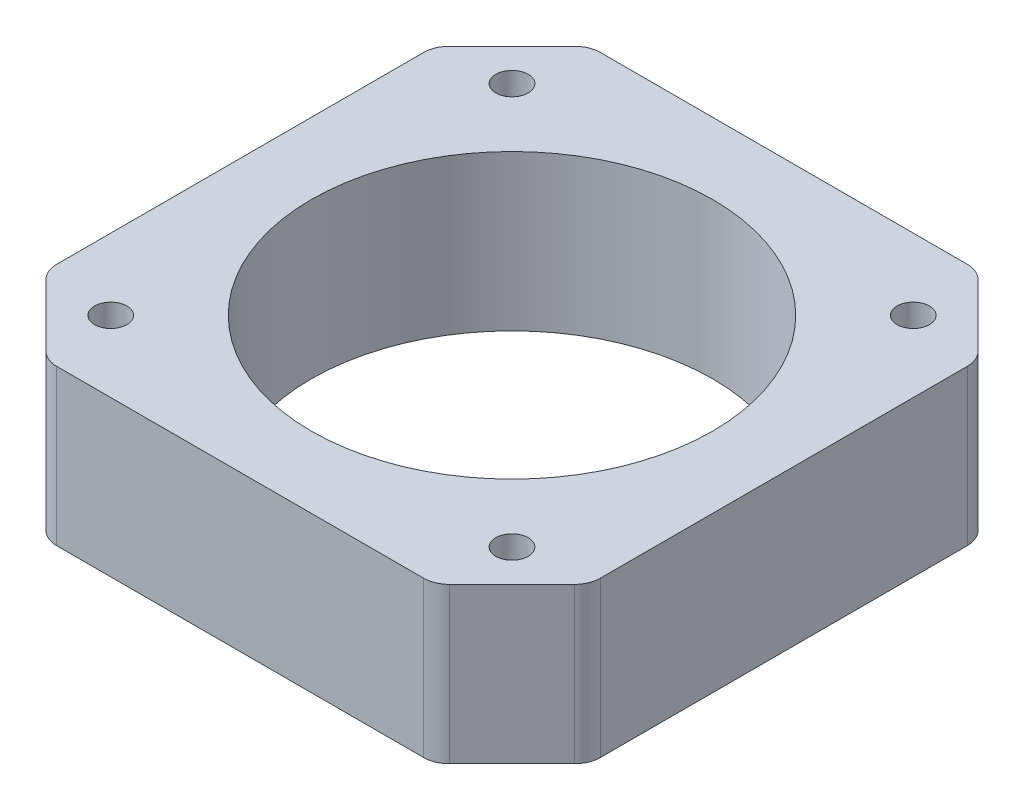
ISO-10303-21;
HEADER;
FILE_DESCRIPTION(('STEP AP214'),'2;1');
FILE_NAME('part.step','',(''),(''),'','','');
FILE_SCHEMA(('AUTOMOTIVE_DESIGN { 1 0 10303 214 1 1 1 1 }'));
ENDSEC;
DATA;
#1=APPLICATION_CONTEXT('core data for automotive mechanical design processes');
#2=APPLICATION_PROTOCOL_DEFINITION('international standard','automotive_design',2000,#1);
#3=PRODUCT_CONTEXT('',#1,'mechanical');
#4=PRODUCT('Part','Part','',(#3));
#5=PRODUCT_RELATED_PRODUCT_CATEGORY('part','',(#4));
#6=PRODUCT_DEFINITION_FORMATION('','',#4);
#7=PRODUCT_DEFINITION_CONTEXT('part definition',#1,'design');
#8=PRODUCT_DEFINITION('design','',#6,#7);
#9=PRODUCT_DEFINITION_SHAPE('','',#8);
#10=(LENGTH_UNIT() NAMED_UNIT(*) SI_UNIT(.MILLI.,.METRE.));
#11=(NAMED_UNIT(*) PLANE_ANGLE_UNIT() SI_UNIT($,.RADIAN.));
#12=(NAMED_UNIT(*) SI_UNIT($,.STERADIAN.) SOLID_ANGLE_UNIT());
#13=UNCERTAINTY_MEASURE_WITH_UNIT(LENGTH_MEASURE(1.E-05),#10,'distance_accuracy_value','');
#14=(GEOMETRIC_REPRESENTATION_CONTEXT(3) GLOBAL_UNCERTAINTY_ASSIGNED_CONTEXT((#13)) GLOBAL_UNIT_ASSIGNED_CONTEXT((#10,
#11,#12)) REPRESENTATION_CONTEXT('',''));
#15=CARTESIAN_POINT('',(0.,0.,0.));
#16=DIRECTION('',(0.,0.,1.));
#17=DIRECTION('',(1.,0.,0.));
#18=AXIS2_PLACEMENT_3D('',#15,#16,#17);
#19=CARTESIAN_POINT('',(0.,12.,0.));
#20=DIRECTION('',(0.,-1.,0.));
#21=DIRECTION('',(0.,0.,-1.));
#22=AXIS2_PLACEMENT_3D('',#19,#20,#21);
#23=PLANE('',#22);
#24=DIRECTION('',(-0.707106781186548,0.,-0.707106781186548));
#25=VECTOR('',#24,1.);
#26=CARTESIAN_POINT('',(21.,12.,-15.0009897922684));
#27=LINE('',#26,#25);
#28=CARTESIAN_POINT('',(20.4142135623731,12.,-15.5867762298953));
#29=VERTEX_POINT('',#28);
#30=CARTESIAN_POINT('',(15.5857864376269,12.,-20.4152033546415));
#31=VERTEX_POINT('',#30);
#32=EDGE_CURVE('E187',#29,#31,#27,.T.);
#33=ORIENTED_EDGE('',*,*,#32,.T.);
#34=CARTESIAN_POINT('',(14.1715728752538,12.,-19.0009897922684));
#35=DIRECTION('',(0.,-1.,0.));
#36=DIRECTION('',(0.,0.,-1.));
#37=AXIS2_PLACEMENT_3D('',#34,#35,#36);
#38=CIRCLE('',#37,2.);
#39=CARTESIAN_POINT('',(14.1715728752538,12.,-21.0009897922684));
#40=VERTEX_POINT('',#39);
#41=EDGE_CURVE('E233',#31,#40,#38,.F.);
#42=ORIENTED_EDGE('',*,*,#41,.T.);
#43=DIRECTION('',(-1.,0.,0.));
#44=VECTOR('',#43,1.);
#45=CARTESIAN_POINT('',(15.,12.,-21.0009897922684));
#46=LINE('',#45,#44);
#47=CARTESIAN_POINT('',(-14.1715728752538,12.,-21.0009897922684));
#48=VERTEX_POINT('',#47);
#49=EDGE_CURVE('E169',#40,#48,#46,.T.);
#50=ORIENTED_EDGE('',*,*,#49,.T.);
#51=CARTESIAN_POINT('',(-14.1715728752538,12.,-19.0009897922684));
#52=DIRECTION('',(0.,-1.,0.));
#53=DIRECTION('',(0.,0.,-1.));
#54=AXIS2_PLACEMENT_3D('',#51,#52,#53);
#55=CIRCLE('',#54,2.);
#56=CARTESIAN_POINT('',(-15.5857864376269,12.,-20.4152033546415));
#57=VERTEX_POINT('',#56);
#58=EDGE_CURVE('E222',#48,#57,#55,.F.);
#59=ORIENTED_EDGE('',*,*,#58,.T.);
#60=DIRECTION('',(-0.707106781186547,0.,0.707106781186548));
#61=VECTOR('',#60,1.);
#62=CARTESIAN_POINT('',(-15.,12.,-21.0009897922684));
#63=LINE('',#62,#61);
#64=CARTESIAN_POINT('',(-20.4142135623731,12.,-15.5867762298953));
#65=VERTEX_POINT('',#64);
#66=EDGE_CURVE('E263',#57,#65,#63,.T.);
#67=ORIENTED_EDGE('',*,*,#66,.T.);
#68=CARTESIAN_POINT('',(-19.,12.,-14.1725626675222));
#69=DIRECTION('',(0.,-1.,0.));
#70=DIRECTION('',(0.,0.,-1.));
#71=AXIS2_PLACEMENT_3D('',#68,#69,#70);
#72=CIRCLE('',#71,2.);
#73=CARTESIAN_POINT('',(-21.,12.,-14.1725626675222));
#74=VERTEX_POINT('',#73);
#75=EDGE_CURVE('E220',#65,#74,#72,.F.);
#76=ORIENTED_EDGE('',*,*,#75,.T.);
#77=DIRECTION('',(0.,0.,1.));
#78=VECTOR('',#77,1.);
#79=CARTESIAN_POINT('',(-21.,12.,15.0009897922684));
#80=LINE('',#79,#78);
#81=CARTESIAN_POINT('',(-21.,12.,14.1725626675222));
#82=VERTEX_POINT('',#81);
#83=EDGE_CURVE('E272',#74,#82,#80,.T.);
#84=ORIENTED_EDGE('',*,*,#83,.T.);
#85=CARTESIAN_POINT('',(-19.,12.,14.1725626675222));
#86=DIRECTION('',(0.,-1.,0.));
#87=DIRECTION('',(0.,0.,-1.));
#88=AXIS2_PLACEMENT_3D('',#85,#86,#87);
#89=CIRCLE('',#88,2.);
#90=CARTESIAN_POINT('',(-20.4142135623731,12.,15.5867762298953));
#91=VERTEX_POINT('',#90);
#92=EDGE_CURVE('E224',#82,#91,#89,.F.);
#93=ORIENTED_EDGE('',*,*,#92,.T.);
#94=DIRECTION('',(0.707106781186548,0.,0.707106781186548));
#95=VECTOR('',#94,1.);
#96=CARTESIAN_POINT('',(-15.,12.,21.0009897922684));
#97=LINE('',#96,#95);
#98=CARTESIAN_POINT('',(-15.5857864376269,12.,20.4152033546415));
#99=VERTEX_POINT('',#98);
#100=EDGE_CURVE('E289',#91,#99,#97,.T.);
#101=ORIENTED_EDGE('',*,*,#100,.T.);
#102=CARTESIAN_POINT('',(-14.1715728752538,12.,19.0009897922684));
#103=DIRECTION('',(0.,-1.,0.));
#104=DIRECTION('',(0.,0.,-1.));
#105=AXIS2_PLACEMENT_3D('',#102,#103,#104);
#106=CIRCLE('',#105,2.);
#107=CARTESIAN_POINT('',(-14.1715728752538,12.,21.0009897922684));
#108=VERTEX_POINT('',#107);
#109=EDGE_CURVE('E226',#99,#108,#106,.F.);
#110=ORIENTED_EDGE('',*,*,#109,.T.);
#111=DIRECTION('',(1.,0.,0.));
#112=VECTOR('',#111,1.);
#113=CARTESIAN_POINT('',(15.,12.,21.0009897922684));
#114=LINE('',#113,#112);
#115=CARTESIAN_POINT('',(14.1715728752538,12.,21.0009897922684));
#116=VERTEX_POINT('',#115);
#117=EDGE_CURVE('E291',#108,#116,#114,.T.);
#118=ORIENTED_EDGE('',*,*,#117,.T.);
#119=CARTESIAN_POINT('',(14.1715728752538,12.,19.0009897922684));
#120=DIRECTION('',(0.,-1.,0.));
#121=DIRECTION('',(0.,0.,-1.));
#122=AXIS2_PLACEMENT_3D('',#119,#120,#121);
#123=CIRCLE('',#122,2.);
#124=CARTESIAN_POINT('',(15.5857864376269,12.,20.4152033546415));
#125=VERTEX_POINT('',#124);
#126=EDGE_CURVE('E228',#116,#125,#123,.F.);
#127=ORIENTED_EDGE('',*,*,#126,.T.);
#128=DIRECTION('',(0.707106781186547,0.,-0.707106781186548));
#129=VECTOR('',#128,1.);
#130=CARTESIAN_POINT('',(21.,12.,15.0009897922684));
#131=LINE('',#130,#129);
#132=CARTESIAN_POINT('',(20.4142135623731,12.,15.5867762298953));
#133=VERTEX_POINT('',#132);
#134=EDGE_CURVE('E294',#125,#133,#131,.T.);
#135=ORIENTED_EDGE('',*,*,#134,.T.);
#136=CARTESIAN_POINT('',(19.,12.,14.1725626675222));
#137=DIRECTION('',(0.,-1.,0.));
#138=DIRECTION('',(0.,0.,-1.));
#139=AXIS2_PLACEMENT_3D('',#136,#137,#138);
#140=CIRCLE('',#139,2.);
#141=CARTESIAN_POINT('',(21.,12.,14.1725626675222));
#142=VERTEX_POINT('',#141);
#143=EDGE_CURVE('E56',#133,#142,#140,.F.);
#144=ORIENTED_EDGE('',*,*,#143,.T.);
#145=DIRECTION('',(0.,0.,-1.));
#146=VECTOR('',#145,1.);
#147=CARTESIAN_POINT('',(21.,12.,15.0009897922684));
#148=LINE('',#147,#146);
#149=CARTESIAN_POINT('',(21.,12.,-14.1725626675222));
#150=VERTEX_POINT('',#149);
#151=EDGE_CURVE('E298',#142,#150,#148,.T.);
#152=ORIENTED_EDGE('',*,*,#151,.T.);
#153=CARTESIAN_POINT('',(19.,12.,-14.1725626675222));
#154=DIRECTION('',(0.,-1.,0.));
#155=DIRECTION('',(0.,0.,-1.));
#156=AXIS2_PLACEMENT_3D('',#153,#154,#155);
#157=CIRCLE('',#156,2.);
#158=EDGE_CURVE('E231',#150,#29,#157,.F.);
#159=ORIENTED_EDGE('',*,*,#158,.T.);
#160=EDGE_LOOP('',(#33,#42,#50,#59,#67,#76,#84,#93,#101,#110,#118,#127,#135,#144,#152,#159));
#161=FACE_BOUND('',#160,.T.);
#162=CARTESIAN_POINT('',(0.,12.,0.));
#163=DIRECTION('',(0.,1.,0.));
#164=DIRECTION('',(0.,0.,1.));
#165=AXIS2_PLACEMENT_3D('',#162,#163,#164);
#166=CIRCLE('',#165,15.5);
#167=CARTESIAN_POINT('',(0.,12.,15.5));
#168=VERTEX_POINT('',#167);
#169=EDGE_CURVE('E178',#168,#168,#166,.T.);
#170=ORIENTED_EDGE('',*,*,#169,.F.);
#171=EDGE_LOOP('',(#170));
#172=FACE_BOUND('',#171,.T.);
#173=CARTESIAN_POINT('',(-15.5,12.,-15.5));
#174=DIRECTION('',(0.,1.,0.));
#175=DIRECTION('',(0.,0.,1.));
#176=AXIS2_PLACEMENT_3D('',#173,#174,#175);
#177=CIRCLE('',#176,1.25000000000001);
#178=CARTESIAN_POINT('',(-15.5,12.,-14.25));
#179=VERTEX_POINT('',#178);
#180=EDGE_CURVE('E410',#179,#179,#177,.T.);
#181=ORIENTED_EDGE('',*,*,#180,.F.);
#182=EDGE_LOOP('',(#181));
#183=FACE_BOUND('',#182,.T.);
#184=CARTESIAN_POINT('',(15.5,12.,-15.5));
#185=DIRECTION('',(0.,1.,0.));
#186=DIRECTION('',(0.,0.,1.));
#187=AXIS2_PLACEMENT_3D('',#184,#185,#186);
#188=CIRCLE('',#187,1.25000000000001);
#189=CARTESIAN_POINT('',(15.5,12.,-14.25));
#190=VERTEX_POINT('',#189);
#191=EDGE_CURVE('E415',#190,#190,#188,.T.);
#192=ORIENTED_EDGE('',*,*,#191,.F.);
#193=EDGE_LOOP('',(#192));
#194=FACE_BOUND('',#193,.T.);
#195=CARTESIAN_POINT('',(-15.5,12.,15.5));
#196=DIRECTION('',(0.,1.,0.));
#197=DIRECTION('',(0.,0.,1.));
#198=AXIS2_PLACEMENT_3D('',#195,#196,#197);
#199=CIRCLE('',#198,1.25000000000001);
#200=CARTESIAN_POINT('',(-15.5,12.,16.75));
#201=VERTEX_POINT('',#200);
#202=EDGE_CURVE('E421',#201,#201,#199,.T.);
#203=ORIENTED_EDGE('',*,*,#202,.F.);
#204=EDGE_LOOP('',(#203));
#205=FACE_BOUND('',#204,.T.);
#206=CARTESIAN_POINT('',(15.5,12.,15.5));
#207=DIRECTION('',(0.,1.,0.));
#208=DIRECTION('',(0.,0.,1.));
#209=AXIS2_PLACEMENT_3D('',#206,#207,#208);
#210=CIRCLE('',#209,1.25000000000001);
#211=CARTESIAN_POINT('',(15.5,12.,16.75));
#212=VERTEX_POINT('',#211);
#213=EDGE_CURVE('E427',#212,#212,#210,.T.);
#214=ORIENTED_EDGE('',*,*,#213,.F.);
#215=EDGE_LOOP('',(#214));
#216=FACE_BOUND('',#215,.T.);
#217=ADVANCED_FACE('F34',(#161,#172,#183,#194,#205,#216),#23,.F.);
#218=CARTESIAN_POINT('',(0.,0.,0.));
#219=DIRECTION('',(0.,-1.,0.));
#220=DIRECTION('',(0.,0.,-1.));
#221=AXIS2_PLACEMENT_3D('',#218,#219,#220);
#222=PLANE('',#221);
#223=CARTESIAN_POINT('',(-15.5,0.,15.5));
#224=DIRECTION('',(0.,1.,0.));
#225=DIRECTION('',(0.,0.,1.));
#226=AXIS2_PLACEMENT_3D('',#223,#224,#225);
#227=CIRCLE('',#226,1.25000000000001);
#228=CARTESIAN_POINT('',(-15.5,0.,16.75));
#229=VERTEX_POINT('',#228);
#230=EDGE_CURVE('E424',#229,#229,#227,.T.);
#231=ORIENTED_EDGE('',*,*,#230,.T.);
#232=EDGE_LOOP('',(#231));
#233=FACE_BOUND('',#232,.T.);
#234=CARTESIAN_POINT('',(-15.5,0.,-15.5));
#235=DIRECTION('',(0.,1.,0.));
#236=DIRECTION('',(0.,0.,1.));
#237=AXIS2_PLACEMENT_3D('',#234,#235,#236);
#238=CIRCLE('',#237,1.25000000000001);
#239=CARTESIAN_POINT('',(-15.5,0.,-14.25));
#240=VERTEX_POINT('',#239);
#241=EDGE_CURVE('E412',#240,#240,#238,.T.);
#242=ORIENTED_EDGE('',*,*,#241,.T.);
#243=EDGE_LOOP('',(#242));
#244=FACE_BOUND('',#243,.T.);
#245=DIRECTION('',(-1.,0.,0.));
#246=VECTOR('',#245,1.);
#247=CARTESIAN_POINT('',(15.,0.,-21.0009897922684));
#248=LINE('',#247,#246);
#249=CARTESIAN_POINT('',(14.1715728752538,0.,-21.0009897922684));
#250=VERTEX_POINT('',#249);
#251=CARTESIAN_POINT('',(-14.1715728752538,0.,-21.0009897922684));
#252=VERTEX_POINT('',#251);
#253=EDGE_CURVE('E166',#250,#252,#248,.T.);
#254=ORIENTED_EDGE('',*,*,#253,.F.);
#255=CARTESIAN_POINT('',(14.1715728752538,0.,-19.0009897922684));
#256=DIRECTION('',(0.,-1.,0.));
#257=DIRECTION('',(0.,0.,-1.));
#258=AXIS2_PLACEMENT_3D('',#255,#256,#257);
#259=CIRCLE('',#258,2.);
#260=CARTESIAN_POINT('',(15.5857864376269,0.,-20.4152033546415));
#261=VERTEX_POINT('',#260);
#262=EDGE_CURVE('E149',#250,#261,#259,.T.);
#263=ORIENTED_EDGE('',*,*,#262,.T.);
#264=DIRECTION('',(-0.707106781186548,0.,-0.707106781186548));
#265=VECTOR('',#264,1.);
#266=CARTESIAN_POINT('',(21.,0.,-15.0009897922684));
#267=LINE('',#266,#265);
#268=CARTESIAN_POINT('',(20.4142135623731,0.,-15.5867762298953));
#269=VERTEX_POINT('',#268);
#270=EDGE_CURVE('E203',#269,#261,#267,.T.);
#271=ORIENTED_EDGE('',*,*,#270,.F.);
#272=CARTESIAN_POINT('',(19.,0.,-14.1725626675222));
#273=DIRECTION('',(0.,-1.,0.));
#274=DIRECTION('',(0.,0.,-1.));
#275=AXIS2_PLACEMENT_3D('',#272,#273,#274);
#276=CIRCLE('',#275,2.);
#277=CARTESIAN_POINT('',(21.,0.,-14.1725626675222));
#278=VERTEX_POINT('',#277);
#279=EDGE_CURVE('E160',#269,#278,#276,.T.);
#280=ORIENTED_EDGE('',*,*,#279,.T.);
#281=DIRECTION('',(0.,0.,-1.));
#282=VECTOR('',#281,1.);
#283=CARTESIAN_POINT('',(21.,0.,15.0009897922684));
#284=LINE('',#283,#282);
#285=CARTESIAN_POINT('',(21.,0.,14.1725626675222));
#286=VERTEX_POINT('',#285);
#287=EDGE_CURVE('E201',#286,#278,#284,.T.);
#288=ORIENTED_EDGE('',*,*,#287,.F.);
#289=CARTESIAN_POINT('',(19.,0.,14.1725626675222));
#290=DIRECTION('',(0.,-1.,0.));
#291=DIRECTION('',(0.,0.,-1.));
#292=AXIS2_PLACEMENT_3D('',#289,#290,#291);
#293=CIRCLE('',#292,2.);
#294=CARTESIAN_POINT('',(20.4142135623731,0.,15.5867762298953));
#295=VERTEX_POINT('',#294);
#296=EDGE_CURVE('E214',#286,#295,#293,.T.);
#297=ORIENTED_EDGE('',*,*,#296,.T.);
#298=DIRECTION('',(0.707106781186547,0.,-0.707106781186548));
#299=VECTOR('',#298,1.);
#300=CARTESIAN_POINT('',(21.,0.,15.0009897922684));
#301=LINE('',#300,#299);
#302=CARTESIAN_POINT('',(15.5857864376269,0.,20.4152033546415));
#303=VERTEX_POINT('',#302);
#304=EDGE_CURVE('E198',#303,#295,#301,.T.);
#305=ORIENTED_EDGE('',*,*,#304,.F.);
#306=CARTESIAN_POINT('',(14.1715728752538,0.,19.0009897922684));
#307=DIRECTION('',(0.,-1.,0.));
#308=DIRECTION('',(0.,0.,-1.));
#309=AXIS2_PLACEMENT_3D('',#306,#307,#308);
#310=CIRCLE('',#309,2.);
#311=CARTESIAN_POINT('',(14.1715728752538,0.,21.0009897922684));
#312=VERTEX_POINT('',#311);
#313=EDGE_CURVE('E212',#303,#312,#310,.T.);
#314=ORIENTED_EDGE('',*,*,#313,.T.);
#315=DIRECTION('',(1.,0.,0.));
#316=VECTOR('',#315,1.);
#317=CARTESIAN_POINT('',(15.,0.,21.0009897922684));
#318=LINE('',#317,#316);
#319=CARTESIAN_POINT('',(-14.1715728752538,0.,21.0009897922684));
#320=VERTEX_POINT('',#319);
#321=EDGE_CURVE('E195',#320,#312,#318,.T.);
#322=ORIENTED_EDGE('',*,*,#321,.F.);
#323=CARTESIAN_POINT('',(-14.1715728752538,0.,19.0009897922684));
#324=DIRECTION('',(0.,-1.,0.));
#325=DIRECTION('',(0.,0.,-1.));
#326=AXIS2_PLACEMENT_3D('',#323,#324,#325);
#327=CIRCLE('',#326,2.);
#328=CARTESIAN_POINT('',(-15.5857864376269,0.,20.4152033546415));
#329=VERTEX_POINT('',#328);
#330=EDGE_CURVE('E210',#320,#329,#327,.T.);
#331=ORIENTED_EDGE('',*,*,#330,.T.);
#332=DIRECTION('',(0.707106781186548,0.,0.707106781186548));
#333=VECTOR('',#332,1.);
#334=CARTESIAN_POINT('',(-15.,0.,21.0009897922684));
#335=LINE('',#334,#333);
#336=CARTESIAN_POINT('',(-20.4142135623731,0.,15.5867762298953));
#337=VERTEX_POINT('',#336);
#338=EDGE_CURVE('E192',#337,#329,#335,.T.);
#339=ORIENTED_EDGE('',*,*,#338,.F.);
#340=CARTESIAN_POINT('',(-19.,0.,14.1725626675222));
#341=DIRECTION('',(0.,-1.,0.));
#342=DIRECTION('',(0.,0.,-1.));
#343=AXIS2_PLACEMENT_3D('',#340,#341,#342);
#344=CIRCLE('',#343,2.);
#345=CARTESIAN_POINT('',(-21.,0.,14.1725626675222));
#346=VERTEX_POINT('',#345);
#347=EDGE_CURVE('E208',#337,#346,#344,.T.);
#348=ORIENTED_EDGE('',*,*,#347,.T.);
#349=DIRECTION('',(0.,0.,1.));
#350=VECTOR('',#349,1.);
#351=CARTESIAN_POINT('',(-21.,0.,15.0009897922684));
#352=LINE('',#351,#350);
#353=CARTESIAN_POINT('',(-21.,0.,-14.1725626675222));
#354=VERTEX_POINT('',#353);
#355=EDGE_CURVE('E181',#354,#346,#352,.T.);
#356=ORIENTED_EDGE('',*,*,#355,.F.);
#357=CARTESIAN_POINT('',(-19.,0.,-14.1725626675222));
#358=DIRECTION('',(0.,-1.,0.));
#359=DIRECTION('',(0.,0.,-1.));
#360=AXIS2_PLACEMENT_3D('',#357,#358,#359);
#361=CIRCLE('',#360,2.);
#362=CARTESIAN_POINT('',(-20.4142135623731,0.,-15.5867762298953));
#363=VERTEX_POINT('',#362);
#364=EDGE_CURVE('E170',#354,#363,#361,.T.);
#365=ORIENTED_EDGE('',*,*,#364,.T.);
#366=DIRECTION('',(-0.707106781186547,0.,0.707106781186548));
#367=VECTOR('',#366,1.);
#368=CARTESIAN_POINT('',(-15.,0.,-21.0009897922684));
#369=LINE('',#368,#367);
#370=CARTESIAN_POINT('',(-15.5857864376269,0.,-20.4152033546415));
#371=VERTEX_POINT('',#370);
#372=EDGE_CURVE('E177',#371,#363,#369,.T.);
#373=ORIENTED_EDGE('',*,*,#372,.F.);
#374=CARTESIAN_POINT('',(-14.1715728752538,0.,-19.0009897922684));
#375=DIRECTION('',(0.,-1.,0.));
#376=DIRECTION('',(0.,0.,-1.));
#377=AXIS2_PLACEMENT_3D('',#374,#375,#376);
#378=CIRCLE('',#377,2.);
#379=EDGE_CURVE('E176',#371,#252,#378,.T.);
#380=ORIENTED_EDGE('',*,*,#379,.T.);
#381=EDGE_LOOP('',(#254,#263,#271,#280,#288,#297,#305,#314,#322,#331,#339,#348,#356,#365,#373,#380));
#382=FACE_BOUND('',#381,.T.);
#383=CARTESIAN_POINT('',(0.,0.,0.));
#384=DIRECTION('',(0.,1.,0.));
#385=DIRECTION('',(0.,0.,1.));
#386=AXIS2_PLACEMENT_3D('',#383,#384,#385);
#387=CIRCLE('',#386,15.5);
#388=CARTESIAN_POINT('',(0.,0.,15.5));
#389=VERTEX_POINT('',#388);
#390=EDGE_CURVE('E184',#389,#389,#387,.T.);
#391=ORIENTED_EDGE('',*,*,#390,.T.);
#392=EDGE_LOOP('',(#391));
#393=FACE_BOUND('',#392,.T.);
#394=CARTESIAN_POINT('',(15.5,0.,-15.5));
#395=DIRECTION('',(0.,1.,0.));
#396=DIRECTION('',(0.,0.,1.));
#397=AXIS2_PLACEMENT_3D('',#394,#395,#396);
#398=CIRCLE('',#397,1.25000000000001);
#399=CARTESIAN_POINT('',(15.5,0.,-14.25));
#400=VERTEX_POINT('',#399);
#401=EDGE_CURVE('E418',#400,#400,#398,.T.);
#402=ORIENTED_EDGE('',*,*,#401,.T.);
#403=EDGE_LOOP('',(#402));
#404=FACE_BOUND('',#403,.T.);
#405=CARTESIAN_POINT('',(15.5,0.,15.5));
#406=DIRECTION('',(0.,1.,0.));
#407=DIRECTION('',(0.,0.,1.));
#408=AXIS2_PLACEMENT_3D('',#405,#406,#407);
#409=CIRCLE('',#408,1.25000000000001);
#410=CARTESIAN_POINT('',(15.5,0.,16.75));
#411=VERTEX_POINT('',#410);
#412=EDGE_CURVE('E430',#411,#411,#409,.T.);
#413=ORIENTED_EDGE('',*,*,#412,.T.);
#414=EDGE_LOOP('',(#413));
#415=FACE_BOUND('',#414,.T.);
#416=ADVANCED_FACE('F173',(#233,#244,#382,#393,#404,#415),#222,.T.);
#417=CARTESIAN_POINT('',(15.,12.,-21.0009897922684));
#418=DIRECTION('',(0.,0.,1.));
#419=DIRECTION('',(1.,0.,0.));
#420=AXIS2_PLACEMENT_3D('',#417,#418,#419);
#421=PLANE('',#420);
#422=ORIENTED_EDGE('',*,*,#49,.F.);
#423=DIRECTION('',(0.,-1.,0.));
#424=VECTOR('',#423,1.);
#425=CARTESIAN_POINT('',(14.1715728752538,12.,-21.0009897922684));
#426=LINE('',#425,#424);
#427=EDGE_CURVE('E153',#40,#250,#426,.T.);
#428=ORIENTED_EDGE('',*,*,#427,.T.);
#429=ORIENTED_EDGE('',*,*,#253,.T.);
#430=DIRECTION('',(0.,-1.,0.));
#431=VECTOR('',#430,1.);
#432=CARTESIAN_POINT('',(-14.1715728752538,12.,-21.0009897922684));
#433=LINE('',#432,#431);
#434=EDGE_CURVE('E171',#252,#48,#433,.F.);
#435=ORIENTED_EDGE('',*,*,#434,.T.);
#436=EDGE_LOOP('',(#422,#428,#429,#435));
#437=FACE_BOUND('',#436,.T.);
#438=ADVANCED_FACE('F165',(#437),#421,.F.);
#439=CARTESIAN_POINT('',(-15.,12.,-21.0009897922684));
#440=DIRECTION('',(0.707106781186548,0.,0.707106781186547));
#441=DIRECTION('',(0.707106781186547,0.,-0.707106781186548));
#442=AXIS2_PLACEMENT_3D('',#439,#440,#441);
#443=PLANE('',#442);
#444=ORIENTED_EDGE('',*,*,#66,.F.);
#445=DIRECTION('',(0.,-1.,0.));
#446=VECTOR('',#445,1.);
#447=CARTESIAN_POINT('',(-15.5857864376269,12.,-20.4152033546415));
#448=LINE('',#447,#446);
#449=EDGE_CURVE('E11',#57,#371,#448,.T.);
#450=ORIENTED_EDGE('',*,*,#449,.T.);
#451=ORIENTED_EDGE('',*,*,#372,.T.);
#452=DIRECTION('',(0.,-1.,0.));
#453=VECTOR('',#452,1.);
#454=CARTESIAN_POINT('',(-20.4142135623731,12.,-15.5867762298953));
#455=LINE('',#454,#453);
#456=EDGE_CURVE('E42',#363,#65,#455,.F.);
#457=ORIENTED_EDGE('',*,*,#456,.T.);
#458=EDGE_LOOP('',(#444,#450,#451,#457));
#459=FACE_BOUND('',#458,.T.);
#460=ADVANCED_FACE('F262',(#459),#443,.F.);
#461=CARTESIAN_POINT('',(-21.,12.,15.0009897922684));
#462=DIRECTION('',(1.,0.,0.));
#463=DIRECTION('',(0.,0.,-1.));
#464=AXIS2_PLACEMENT_3D('',#461,#462,#463);
#465=PLANE('',#464);
#466=ORIENTED_EDGE('',*,*,#355,.T.);
#467=DIRECTION('',(0.,-1.,0.));
#468=VECTOR('',#467,1.);
#469=CARTESIAN_POINT('',(-21.,12.,14.1725626675222));
#470=LINE('',#469,#468);
#471=EDGE_CURVE('E257',#346,#82,#470,.F.);
#472=ORIENTED_EDGE('',*,*,#471,.T.);
#473=ORIENTED_EDGE('',*,*,#83,.F.);
#474=DIRECTION('',(0.,-1.,0.));
#475=VECTOR('',#474,1.);
#476=CARTESIAN_POINT('',(-21.,12.,-14.1725626675222));
#477=LINE('',#476,#475);
#478=EDGE_CURVE('E254',#74,#354,#477,.T.);
#479=ORIENTED_EDGE('',*,*,#478,.T.);
#480=EDGE_LOOP('',(#466,#472,#473,#479));
#481=FACE_BOUND('',#480,.T.);
#482=ADVANCED_FACE('F277',(#481),#465,.F.);
#483=CARTESIAN_POINT('',(-15.,12.,21.0009897922684));
#484=DIRECTION('',(0.707106781186547,0.,-0.707106781186547));
#485=DIRECTION('',(-0.707106781186548,0.,-0.707106781186548));
#486=AXIS2_PLACEMENT_3D('',#483,#484,#485);
#487=PLANE('',#486);
#488=ORIENTED_EDGE('',*,*,#338,.T.);
#489=DIRECTION('',(0.,-1.,0.));
#490=VECTOR('',#489,1.);
#491=CARTESIAN_POINT('',(-15.5857864376269,12.,20.4152033546415));
#492=LINE('',#491,#490);
#493=EDGE_CURVE('E252',#329,#99,#492,.F.);
#494=ORIENTED_EDGE('',*,*,#493,.T.);
#495=ORIENTED_EDGE('',*,*,#100,.F.);
#496=DIRECTION('',(0.,-1.,0.));
#497=VECTOR('',#496,1.);
#498=CARTESIAN_POINT('',(-20.4142135623731,12.,15.5867762298953));
#499=LINE('',#498,#497);
#500=EDGE_CURVE('E249',#91,#337,#499,.T.);
#501=ORIENTED_EDGE('',*,*,#500,.T.);
#502=EDGE_LOOP('',(#488,#494,#495,#501));
#503=FACE_BOUND('',#502,.T.);
#504=ADVANCED_FACE('F286',(#503),#487,.F.);
#505=CARTESIAN_POINT('',(15.,12.,21.0009897922684));
#506=DIRECTION('',(0.,0.,-1.));
#507=DIRECTION('',(-1.,0.,0.));
#508=AXIS2_PLACEMENT_3D('',#505,#506,#507);
#509=PLANE('',#508);
#510=ORIENTED_EDGE('',*,*,#321,.T.);
#511=DIRECTION('',(0.,-1.,0.));
#512=VECTOR('',#511,1.);
#513=CARTESIAN_POINT('',(14.1715728752538,12.,21.0009897922684));
#514=LINE('',#513,#512);
#515=EDGE_CURVE('E247',#312,#116,#514,.F.);
#516=ORIENTED_EDGE('',*,*,#515,.T.);
#517=ORIENTED_EDGE('',*,*,#117,.F.);
#518=DIRECTION('',(0.,-1.,0.));
#519=VECTOR('',#518,1.);
#520=CARTESIAN_POINT('',(-14.1715728752538,12.,21.0009897922684));
#521=LINE('',#520,#519);
#522=EDGE_CURVE('E244',#108,#320,#521,.T.);
#523=ORIENTED_EDGE('',*,*,#522,.T.);
#524=EDGE_LOOP('',(#510,#516,#517,#523));
#525=FACE_BOUND('',#524,.T.);
#526=ADVANCED_FACE('F323',(#525),#509,.F.);
#527=CARTESIAN_POINT('',(21.,12.,15.0009897922684));
#528=DIRECTION('',(-0.707106781186548,0.,-0.707106781186547));
#529=DIRECTION('',(-0.707106781186547,0.,0.707106781186548));
#530=AXIS2_PLACEMENT_3D('',#527,#528,#529);
#531=PLANE('',#530);
#532=ORIENTED_EDGE('',*,*,#304,.T.);
#533=DIRECTION('',(0.,-1.,0.));
#534=VECTOR('',#533,1.);
#535=CARTESIAN_POINT('',(20.4142135623731,12.,15.5867762298953));
#536=LINE('',#535,#534);
#537=EDGE_CURVE('E242',#295,#133,#536,.F.);
#538=ORIENTED_EDGE('',*,*,#537,.T.);
#539=ORIENTED_EDGE('',*,*,#134,.F.);
#540=DIRECTION('',(0.,-1.,0.));
#541=VECTOR('',#540,1.);
#542=CARTESIAN_POINT('',(15.5857864376269,12.,20.4152033546415));
#543=LINE('',#542,#541);
#544=EDGE_CURVE('E239',#125,#303,#543,.T.);
#545=ORIENTED_EDGE('',*,*,#544,.T.);
#546=EDGE_LOOP('',(#532,#538,#539,#545));
#547=FACE_BOUND('',#546,.T.);
#548=ADVANCED_FACE('F314',(#547),#531,.F.);
#549=CARTESIAN_POINT('',(21.,12.,15.0009897922684));
#550=DIRECTION('',(-1.,0.,0.));
#551=DIRECTION('',(0.,0.,1.));
#552=AXIS2_PLACEMENT_3D('',#549,#550,#551);
#553=PLANE('',#552);
#554=ORIENTED_EDGE('',*,*,#287,.T.);
#555=DIRECTION('',(0.,-1.,0.));
#556=VECTOR('',#555,1.);
#557=CARTESIAN_POINT('',(21.,12.,-14.1725626675222));
#558=LINE('',#557,#556);
#559=EDGE_CURVE('E49',#278,#150,#558,.F.);
#560=ORIENTED_EDGE('',*,*,#559,.T.);
#561=ORIENTED_EDGE('',*,*,#151,.F.);
#562=DIRECTION('',(0.,-1.,0.));
#563=VECTOR('',#562,1.);
#564=CARTESIAN_POINT('',(21.,12.,14.1725626675222));
#565=LINE('',#564,#563);
#566=EDGE_CURVE('E235',#142,#286,#565,.T.);
#567=ORIENTED_EDGE('',*,*,#566,.T.);
#568=EDGE_LOOP('',(#554,#560,#561,#567));
#569=FACE_BOUND('',#568,.T.);
#570=ADVANCED_FACE('F307',(#569),#553,.F.);
#571=CARTESIAN_POINT('',(21.,12.,-15.0009897922684));
#572=DIRECTION('',(-0.707106781186547,0.,0.707106781186547));
#573=DIRECTION('',(0.707106781186548,0.,0.707106781186548));
#574=AXIS2_PLACEMENT_3D('',#571,#572,#573);
#575=PLANE('',#574);
#576=ORIENTED_EDGE('',*,*,#270,.T.);
#577=DIRECTION('',(0.,-1.,0.));
#578=VECTOR('',#577,1.);
#579=CARTESIAN_POINT('',(15.5857864376269,12.,-20.4152033546415));
#580=LINE('',#579,#578);
#581=EDGE_CURVE('E154',#261,#31,#580,.F.);
#582=ORIENTED_EDGE('',*,*,#581,.T.);
#583=ORIENTED_EDGE('',*,*,#32,.F.);
#584=DIRECTION('',(0.,-1.,0.));
#585=VECTOR('',#584,1.);
#586=CARTESIAN_POINT('',(20.4142135623731,12.,-15.5867762298953));
#587=LINE('',#586,#585);
#588=EDGE_CURVE('E159',#29,#269,#587,.T.);
#589=ORIENTED_EDGE('',*,*,#588,.T.);
#590=EDGE_LOOP('',(#576,#582,#583,#589));
#591=FACE_BOUND('',#590,.T.);
#592=ADVANCED_FACE('F303',(#591),#575,.F.);
#593=CARTESIAN_POINT('',(0.,12.,0.));
#594=DIRECTION('',(0.,-1.,0.));
#595=DIRECTION('',(0.,0.,-1.));
#596=AXIS2_PLACEMENT_3D('',#593,#594,#595);
#597=CYLINDRICAL_SURFACE('',#596,15.5);
#598=ORIENTED_EDGE('',*,*,#169,.T.);
#599=EDGE_LOOP('',(#598));
#600=FACE_BOUND('',#599,.T.);
#601=ORIENTED_EDGE('',*,*,#390,.F.);
#602=EDGE_LOOP('',(#601));
#603=FACE_BOUND('',#602,.T.);
#604=ADVANCED_FACE('F345',(#600,#603),#597,.F.);
#605=CARTESIAN_POINT('',(-15.5,12.,-15.5));
#606=DIRECTION('',(0.,-1.,0.));
#607=DIRECTION('',(0.,0.,-1.));
#608=AXIS2_PLACEMENT_3D('',#605,#606,#607);
#609=CYLINDRICAL_SURFACE('',#608,1.25000000000001);
#610=ORIENTED_EDGE('',*,*,#180,.T.);
#611=EDGE_LOOP('',(#610));
#612=FACE_BOUND('',#611,.T.);
#613=ORIENTED_EDGE('',*,*,#241,.F.);
#614=EDGE_LOOP('',(#613));
#615=FACE_BOUND('',#614,.T.);
#616=ADVANCED_FACE('F451',(#612,#615),#609,.F.);
#617=CARTESIAN_POINT('',(15.5,12.,-15.5));
#618=DIRECTION('',(0.,-1.,0.));
#619=DIRECTION('',(0.,0.,-1.));
#620=AXIS2_PLACEMENT_3D('',#617,#618,#619);
#621=CYLINDRICAL_SURFACE('',#620,1.25000000000001);
#622=ORIENTED_EDGE('',*,*,#191,.T.);
#623=EDGE_LOOP('',(#622));
#624=FACE_BOUND('',#623,.T.);
#625=ORIENTED_EDGE('',*,*,#401,.F.);
#626=EDGE_LOOP('',(#625));
#627=FACE_BOUND('',#626,.T.);
#628=ADVANCED_FACE('F446',(#624,#627),#621,.F.);
#629=CARTESIAN_POINT('',(-15.5,12.,15.5));
#630=DIRECTION('',(0.,-1.,0.));
#631=DIRECTION('',(0.,0.,-1.));
#632=AXIS2_PLACEMENT_3D('',#629,#630,#631);
#633=CYLINDRICAL_SURFACE('',#632,1.25000000000001);
#634=ORIENTED_EDGE('',*,*,#202,.T.);
#635=EDGE_LOOP('',(#634));
#636=FACE_BOUND('',#635,.T.);
#637=ORIENTED_EDGE('',*,*,#230,.F.);
#638=EDGE_LOOP('',(#637));
#639=FACE_BOUND('',#638,.T.);
#640=ADVANCED_FACE('F439',(#636,#639),#633,.F.);
#641=CARTESIAN_POINT('',(15.5,12.,15.5));
#642=DIRECTION('',(0.,-1.,0.));
#643=DIRECTION('',(0.,0.,-1.));
#644=AXIS2_PLACEMENT_3D('',#641,#642,#643);
#645=CYLINDRICAL_SURFACE('',#644,1.25000000000001);
#646=ORIENTED_EDGE('',*,*,#213,.T.);
#647=EDGE_LOOP('',(#646));
#648=FACE_BOUND('',#647,.T.);
#649=ORIENTED_EDGE('',*,*,#412,.F.);
#650=EDGE_LOOP('',(#649));
#651=FACE_BOUND('',#650,.T.);
#652=ADVANCED_FACE('F366',(#648,#651),#645,.F.);
#653=CARTESIAN_POINT('',(14.1715728752538,12.,-19.0009897922684));
#654=DIRECTION('',(0.,-1.,0.));
#655=DIRECTION('',(0.,0.,-1.));
#656=AXIS2_PLACEMENT_3D('',#653,#654,#655);
#657=CYLINDRICAL_SURFACE('',#656,2.);
#658=ORIENTED_EDGE('',*,*,#41,.F.);
#659=ORIENTED_EDGE('',*,*,#581,.F.);
#660=ORIENTED_EDGE('',*,*,#262,.F.);
#661=ORIENTED_EDGE('',*,*,#427,.F.);
#662=EDGE_LOOP('',(#658,#659,#660,#661));
#663=FACE_BOUND('',#662,.T.);
#664=ADVANCED_FACE('F152',(#663),#657,.T.);
#665=CARTESIAN_POINT('',(19.,12.,-14.1725626675222));
#666=DIRECTION('',(0.,-1.,0.));
#667=DIRECTION('',(0.,0.,-1.));
#668=AXIS2_PLACEMENT_3D('',#665,#666,#667);
#669=CYLINDRICAL_SURFACE('',#668,2.);
#670=ORIENTED_EDGE('',*,*,#158,.F.);
#671=ORIENTED_EDGE('',*,*,#559,.F.);
#672=ORIENTED_EDGE('',*,*,#279,.F.);
#673=ORIENTED_EDGE('',*,*,#588,.F.);
#674=EDGE_LOOP('',(#670,#671,#672,#673));
#675=FACE_BOUND('',#674,.T.);
#676=ADVANCED_FACE('F305',(#675),#669,.T.);
#677=CARTESIAN_POINT('',(19.,12.,14.1725626675222));
#678=DIRECTION('',(0.,-1.,0.));
#679=DIRECTION('',(0.,0.,-1.));
#680=AXIS2_PLACEMENT_3D('',#677,#678,#679);
#681=CYLINDRICAL_SURFACE('',#680,2.);
#682=ORIENTED_EDGE('',*,*,#143,.F.);
#683=ORIENTED_EDGE('',*,*,#537,.F.);
#684=ORIENTED_EDGE('',*,*,#296,.F.);
#685=ORIENTED_EDGE('',*,*,#566,.F.);
#686=EDGE_LOOP('',(#682,#683,#684,#685));
#687=FACE_BOUND('',#686,.T.);
#688=ADVANCED_FACE('F310',(#687),#681,.T.);
#689=CARTESIAN_POINT('',(14.1715728752538,12.,19.0009897922684));
#690=DIRECTION('',(0.,-1.,0.));
#691=DIRECTION('',(0.,0.,-1.));
#692=AXIS2_PLACEMENT_3D('',#689,#690,#691);
#693=CYLINDRICAL_SURFACE('',#692,2.);
#694=ORIENTED_EDGE('',*,*,#126,.F.);
#695=ORIENTED_EDGE('',*,*,#515,.F.);
#696=ORIENTED_EDGE('',*,*,#313,.F.);
#697=ORIENTED_EDGE('',*,*,#544,.F.);
#698=EDGE_LOOP('',(#694,#695,#696,#697));
#699=FACE_BOUND('',#698,.T.);
#700=ADVANCED_FACE('F319',(#699),#693,.T.);
#701=CARTESIAN_POINT('',(-14.1715728752538,12.,19.0009897922684));
#702=DIRECTION('',(0.,-1.,0.));
#703=DIRECTION('',(0.,0.,-1.));
#704=AXIS2_PLACEMENT_3D('',#701,#702,#703);
#705=CYLINDRICAL_SURFACE('',#704,2.);
#706=ORIENTED_EDGE('',*,*,#109,.F.);
#707=ORIENTED_EDGE('',*,*,#493,.F.);
#708=ORIENTED_EDGE('',*,*,#330,.F.);
#709=ORIENTED_EDGE('',*,*,#522,.F.);
#710=EDGE_LOOP('',(#706,#707,#708,#709));
#711=FACE_BOUND('',#710,.T.);
#712=ADVANCED_FACE('F327',(#711),#705,.T.);
#713=CARTESIAN_POINT('',(-19.,12.,14.1725626675222));
#714=DIRECTION('',(0.,-1.,0.));
#715=DIRECTION('',(0.,0.,-1.));
#716=AXIS2_PLACEMENT_3D('',#713,#714,#715);
#717=CYLINDRICAL_SURFACE('',#716,2.);
#718=ORIENTED_EDGE('',*,*,#92,.F.);
#719=ORIENTED_EDGE('',*,*,#471,.F.);
#720=ORIENTED_EDGE('',*,*,#347,.F.);
#721=ORIENTED_EDGE('',*,*,#500,.F.);
#722=EDGE_LOOP('',(#718,#719,#720,#721));
#723=FACE_BOUND('',#722,.T.);
#724=ADVANCED_FACE('F283',(#723),#717,.T.);
#725=CARTESIAN_POINT('',(-14.1715728752538,12.,-19.0009897922684));
#726=DIRECTION('',(0.,-1.,0.));
#727=DIRECTION('',(0.,0.,-1.));
#728=AXIS2_PLACEMENT_3D('',#725,#726,#727);
#729=CYLINDRICAL_SURFACE('',#728,2.);
#730=ORIENTED_EDGE('',*,*,#58,.F.);
#731=ORIENTED_EDGE('',*,*,#434,.F.);
#732=ORIENTED_EDGE('',*,*,#379,.F.);
#733=ORIENTED_EDGE('',*,*,#449,.F.);
#734=EDGE_LOOP('',(#730,#731,#732,#733));
#735=FACE_BOUND('',#734,.T.);
#736=ADVANCED_FACE('F334',(#735),#729,.T.);
#737=CARTESIAN_POINT('',(-19.,12.,-14.1725626675222));
#738=DIRECTION('',(0.,-1.,0.));
#739=DIRECTION('',(0.,0.,-1.));
#740=AXIS2_PLACEMENT_3D('',#737,#738,#739);
#741=CYLINDRICAL_SURFACE('',#740,2.);
#742=ORIENTED_EDGE('',*,*,#75,.F.);
#743=ORIENTED_EDGE('',*,*,#456,.F.);
#744=ORIENTED_EDGE('',*,*,#364,.F.);
#745=ORIENTED_EDGE('',*,*,#478,.F.);
#746=EDGE_LOOP('',(#742,#743,#744,#745));
#747=FACE_BOUND('',#746,.T.);
#748=ADVANCED_FACE('F36',(#747),#741,.T.);
#749=CLOSED_SHELL('',(#217,#416,#438,#460,#482,#504,#526,#548,#570,#592,#604,#616,#628,#640,
#652,#664,#676,#688,#700,#712,#724,#736,#748));
#750=MANIFOLD_SOLID_BREP('B2',#749);
#751=ADVANCED_BREP_SHAPE_REPRESENTATION('',(#18,#750),#14);
#752=SHAPE_DEFINITION_REPRESENTATION(#9,#751);
ENDSEC;
END-ISO-10303-21;
